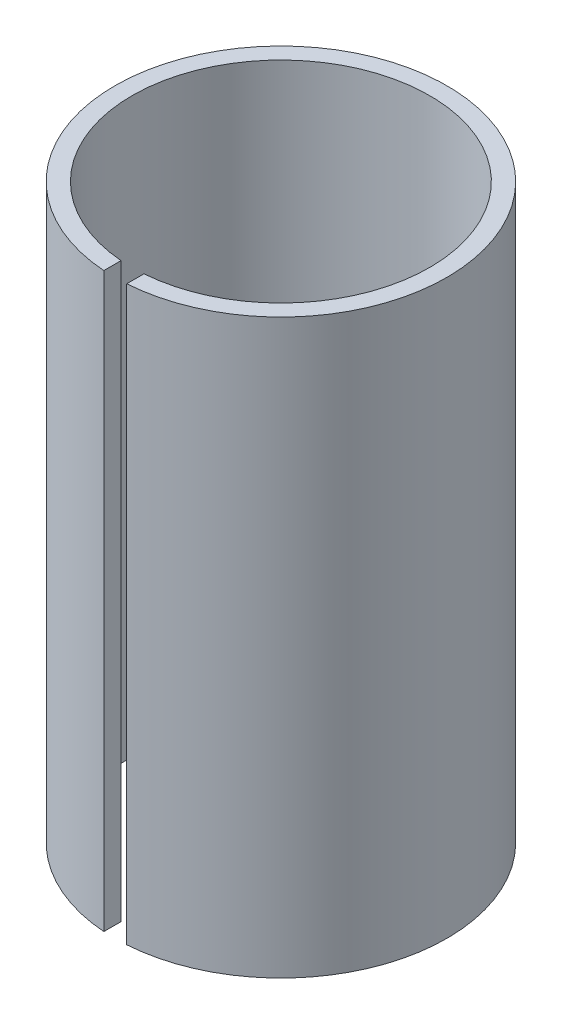
ISO-10303-21;
HEADER;
FILE_DESCRIPTION(('STEP AP214'),'2;1');
FILE_NAME('part.step','',(''),(''),'','','');
FILE_SCHEMA(('AUTOMOTIVE_DESIGN { 1 0 10303 214 1 1 1 1 }'));
ENDSEC;
DATA;
#1=APPLICATION_CONTEXT('core data for automotive mechanical design processes');
#2=APPLICATION_PROTOCOL_DEFINITION('international standard','automotive_design',2000,#1);
#3=PRODUCT_CONTEXT('',#1,'mechanical');
#4=PRODUCT('Part','Part','',(#3));
#5=PRODUCT_RELATED_PRODUCT_CATEGORY('part','',(#4));
#6=PRODUCT_DEFINITION_FORMATION('','',#4);
#7=PRODUCT_DEFINITION_CONTEXT('part definition',#1,'design');
#8=PRODUCT_DEFINITION('design','',#6,#7);
#9=PRODUCT_DEFINITION_SHAPE('','',#8);
#10=(LENGTH_UNIT() NAMED_UNIT(*) SI_UNIT(.MILLI.,.METRE.));
#11=(NAMED_UNIT(*) PLANE_ANGLE_UNIT() SI_UNIT($,.RADIAN.));
#12=(NAMED_UNIT(*) SI_UNIT($,.STERADIAN.) SOLID_ANGLE_UNIT());
#13=UNCERTAINTY_MEASURE_WITH_UNIT(LENGTH_MEASURE(1.E-05),#10,'distance_accuracy_value','');
#14=(GEOMETRIC_REPRESENTATION_CONTEXT(3) GLOBAL_UNCERTAINTY_ASSIGNED_CONTEXT((#13)) GLOBAL_UNIT_ASSIGNED_CONTEXT((#10,
#11,#12)) REPRESENTATION_CONTEXT('',''));
#15=CARTESIAN_POINT('',(0.,0.,0.));
#16=DIRECTION('',(0.,0.,1.));
#17=DIRECTION('',(1.,0.,0.));
#18=AXIS2_PLACEMENT_3D('',#15,#16,#17);
#19=CARTESIAN_POINT('',(0.,50.,0.));
#20=DIRECTION('',(0.,-1.,0.));
#21=DIRECTION('',(0.,0.,-1.));
#22=AXIS2_PLACEMENT_3D('',#19,#20,#21);
#23=CYLINDRICAL_SURFACE('',#22,13.);
#24=CARTESIAN_POINT('',(0.,0.,0.));
#25=DIRECTION('',(0.,1.,0.));
#26=DIRECTION('',(0.,0.,1.));
#27=AXIS2_PLACEMENT_3D('',#24,#25,#26);
#28=CIRCLE('',#27,13.);
#29=CARTESIAN_POINT('',(1.,0.,12.9614813968157));
#30=VERTEX_POINT('',#29);
#31=CARTESIAN_POINT('',(-0.999999999999997,0.,12.9614813968157));
#32=VERTEX_POINT('',#31);
#33=EDGE_CURVE('E106',#30,#32,#28,.T.);
#34=ORIENTED_EDGE('',*,*,#33,.F.);
#35=DIRECTION('',(0.,-1.,0.));
#36=VECTOR('',#35,1.);
#37=CARTESIAN_POINT('',(1.,50.,12.9614813968157));
#38=LINE('',#37,#36);
#39=CARTESIAN_POINT('',(1.,50.,12.9614813968157));
#40=VERTEX_POINT('',#39);
#41=EDGE_CURVE('E11',#40,#30,#38,.T.);
#42=ORIENTED_EDGE('',*,*,#41,.F.);
#43=CARTESIAN_POINT('',(0.,50.,0.));
#44=DIRECTION('',(0.,1.,0.));
#45=DIRECTION('',(0.,0.,1.));
#46=AXIS2_PLACEMENT_3D('',#43,#44,#45);
#47=CIRCLE('',#46,13.);
#48=CARTESIAN_POINT('',(-0.999999999999997,50.,12.9614813968157));
#49=VERTEX_POINT('',#48);
#50=EDGE_CURVE('E91',#40,#49,#47,.T.);
#51=ORIENTED_EDGE('',*,*,#50,.T.);
#52=DIRECTION('',(0.,-1.,0.));
#53=VECTOR('',#52,1.);
#54=CARTESIAN_POINT('',(-0.999999999999997,50.,12.9614813968157));
#55=LINE('',#54,#53);
#56=EDGE_CURVE('E59',#49,#32,#55,.T.);
#57=ORIENTED_EDGE('',*,*,#56,.T.);
#58=EDGE_LOOP('',(#34,#42,#51,#57));
#59=FACE_BOUND('',#58,.T.);
#60=ADVANCED_FACE('F43',(#59),#23,.F.);
#61=CARTESIAN_POINT('',(1.,50.,0.));
#62=DIRECTION('',(1.,0.,0.));
#63=DIRECTION('',(0.,0.,-1.));
#64=AXIS2_PLACEMENT_3D('',#61,#62,#63);
#65=PLANE('',#64);
#66=DIRECTION('',(0.,0.,1.));
#67=VECTOR('',#66,1.);
#68=CARTESIAN_POINT('',(1.,0.,0.));
#69=LINE('',#68,#67);
#70=CARTESIAN_POINT('',(1.,0.,14.4654761414894));
#71=VERTEX_POINT('',#70);
#72=EDGE_CURVE('E97',#30,#71,#69,.T.);
#73=ORIENTED_EDGE('',*,*,#72,.T.);
#74=DIRECTION('',(0.,-1.,0.));
#75=VECTOR('',#74,1.);
#76=CARTESIAN_POINT('',(1.,50.,14.4654761414894));
#77=LINE('',#76,#75);
#78=CARTESIAN_POINT('',(1.,50.,14.4654761414894));
#79=VERTEX_POINT('',#78);
#80=EDGE_CURVE('E51',#79,#71,#77,.T.);
#81=ORIENTED_EDGE('',*,*,#80,.F.);
#82=DIRECTION('',(0.,0.,1.));
#83=VECTOR('',#82,1.);
#84=CARTESIAN_POINT('',(1.,50.,0.));
#85=LINE('',#84,#83);
#86=EDGE_CURVE('E85',#40,#79,#85,.T.);
#87=ORIENTED_EDGE('',*,*,#86,.F.);
#88=ORIENTED_EDGE('',*,*,#41,.T.);
#89=EDGE_LOOP('',(#73,#81,#87,#88));
#90=FACE_BOUND('',#89,.T.);
#91=ADVANCED_FACE('F95',(#90),#65,.F.);
#92=CARTESIAN_POINT('',(0.,50.,0.));
#93=DIRECTION('',(0.,-1.,0.));
#94=DIRECTION('',(0.,0.,-1.));
#95=AXIS2_PLACEMENT_3D('',#92,#93,#94);
#96=CYLINDRICAL_SURFACE('',#95,14.5);
#97=CARTESIAN_POINT('',(0.,0.,0.));
#98=DIRECTION('',(0.,1.,0.));
#99=DIRECTION('',(0.,0.,1.));
#100=AXIS2_PLACEMENT_3D('',#97,#98,#99);
#101=CIRCLE('',#100,14.5);
#102=CARTESIAN_POINT('',(-0.999999999999997,0.,14.4654761414894));
#103=VERTEX_POINT('',#102);
#104=EDGE_CURVE('E109',#71,#103,#101,.T.);
#105=ORIENTED_EDGE('',*,*,#104,.T.);
#106=DIRECTION('',(0.,-1.,0.));
#107=VECTOR('',#106,1.);
#108=CARTESIAN_POINT('',(-0.999999999999997,50.,14.4654761414894));
#109=LINE('',#108,#107);
#110=CARTESIAN_POINT('',(-0.999999999999997,50.,14.4654761414894));
#111=VERTEX_POINT('',#110);
#112=EDGE_CURVE('E73',#111,#103,#109,.T.);
#113=ORIENTED_EDGE('',*,*,#112,.F.);
#114=CARTESIAN_POINT('',(0.,50.,0.));
#115=DIRECTION('',(0.,1.,0.));
#116=DIRECTION('',(0.,0.,1.));
#117=AXIS2_PLACEMENT_3D('',#114,#115,#116);
#118=CIRCLE('',#117,14.5);
#119=EDGE_CURVE('E90',#79,#111,#118,.T.);
#120=ORIENTED_EDGE('',*,*,#119,.F.);
#121=ORIENTED_EDGE('',*,*,#80,.T.);
#122=EDGE_LOOP('',(#105,#113,#120,#121));
#123=FACE_BOUND('',#122,.T.);
#124=ADVANCED_FACE('F100',(#123),#96,.T.);
#125=CARTESIAN_POINT('',(-0.999999999999995,50.,0.));
#126=DIRECTION('',(1.,0.,0.));
#127=DIRECTION('',(0.,0.,-1.));
#128=AXIS2_PLACEMENT_3D('',#125,#126,#127);
#129=PLANE('',#128);
#130=DIRECTION('',(0.,0.,1.));
#131=VECTOR('',#130,1.);
#132=CARTESIAN_POINT('',(-0.999999999999995,0.,0.));
#133=LINE('',#132,#131);
#134=EDGE_CURVE('E111',#32,#103,#133,.T.);
#135=ORIENTED_EDGE('',*,*,#134,.F.);
#136=ORIENTED_EDGE('',*,*,#56,.F.);
#137=DIRECTION('',(0.,0.,1.));
#138=VECTOR('',#137,1.);
#139=CARTESIAN_POINT('',(-0.999999999999995,50.,0.));
#140=LINE('',#139,#138);
#141=EDGE_CURVE('E101',#49,#111,#140,.T.);
#142=ORIENTED_EDGE('',*,*,#141,.T.);
#143=ORIENTED_EDGE('',*,*,#112,.T.);
#144=EDGE_LOOP('',(#135,#136,#142,#143));
#145=FACE_BOUND('',#144,.T.);
#146=ADVANCED_FACE('F116',(#145),#129,.T.);
#147=CARTESIAN_POINT('',(0.,50.,0.));
#148=DIRECTION('',(0.,1.,0.));
#149=DIRECTION('',(0.,0.,1.));
#150=AXIS2_PLACEMENT_3D('',#147,#148,#149);
#151=PLANE('',#150);
#152=ORIENTED_EDGE('',*,*,#50,.F.);
#153=ORIENTED_EDGE('',*,*,#86,.T.);
#154=ORIENTED_EDGE('',*,*,#119,.T.);
#155=ORIENTED_EDGE('',*,*,#141,.F.);
#156=EDGE_LOOP('',(#152,#153,#154,#155));
#157=FACE_BOUND('',#156,.T.);
#158=ADVANCED_FACE('F87',(#157),#151,.T.);
#159=CARTESIAN_POINT('',(0.,0.,0.));
#160=DIRECTION('',(0.,1.,0.));
#161=DIRECTION('',(0.,0.,1.));
#162=AXIS2_PLACEMENT_3D('',#159,#160,#161);
#163=PLANE('',#162);
#164=ORIENTED_EDGE('',*,*,#33,.T.);
#165=ORIENTED_EDGE('',*,*,#134,.T.);
#166=ORIENTED_EDGE('',*,*,#104,.F.);
#167=ORIENTED_EDGE('',*,*,#72,.F.);
#168=EDGE_LOOP('',(#164,#165,#166,#167));
#169=FACE_BOUND('',#168,.T.);
#170=ADVANCED_FACE('F123',(#169),#163,.F.);
#171=CLOSED_SHELL('',(#60,#91,#124,#146,#158,#170));
#172=MANIFOLD_SOLID_BREP('B2',#171);
#173=ADVANCED_BREP_SHAPE_REPRESENTATION('',(#18,#172),#14);
#174=SHAPE_DEFINITION_REPRESENTATION(#9,#173);
ENDSEC;
END-ISO-10303-21;
